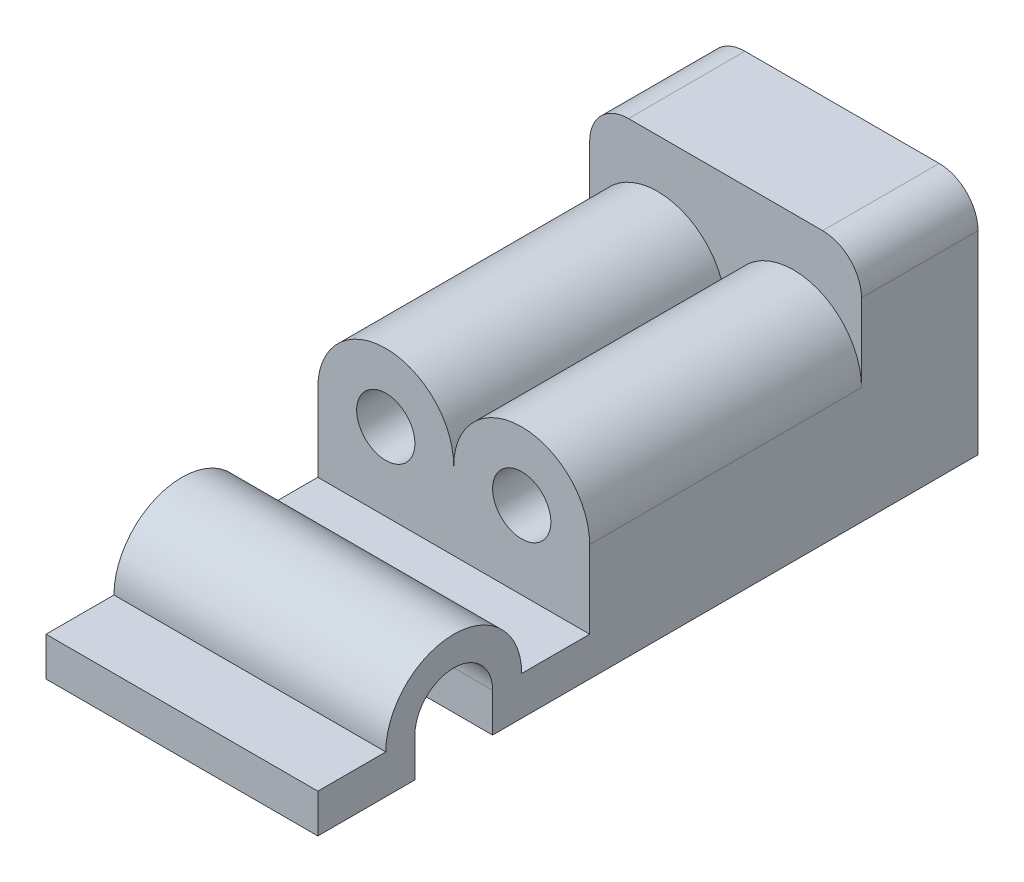
ISO-10303-21;
HEADER;
FILE_DESCRIPTION(('STEP AP214'),'2;1');
FILE_NAME('part.step','',(''),(''),'','','');
FILE_SCHEMA(('AUTOMOTIVE_DESIGN { 1 0 10303 214 1 1 1 1 }'));
ENDSEC;
DATA;
#1=APPLICATION_CONTEXT('core data for automotive mechanical design processes');
#2=APPLICATION_PROTOCOL_DEFINITION('international standard','automotive_design',2000,#1);
#3=PRODUCT_CONTEXT('',#1,'mechanical');
#4=PRODUCT('Part','Part','',(#3));
#5=PRODUCT_RELATED_PRODUCT_CATEGORY('part','',(#4));
#6=PRODUCT_DEFINITION_FORMATION('','',#4);
#7=PRODUCT_DEFINITION_CONTEXT('part definition',#1,'design');
#8=PRODUCT_DEFINITION('design','',#6,#7);
#9=PRODUCT_DEFINITION_SHAPE('','',#8);
#10=(LENGTH_UNIT() NAMED_UNIT(*) SI_UNIT(.MILLI.,.METRE.));
#11=(NAMED_UNIT(*) PLANE_ANGLE_UNIT() SI_UNIT($,.RADIAN.));
#12=(NAMED_UNIT(*) SI_UNIT($,.STERADIAN.) SOLID_ANGLE_UNIT());
#13=UNCERTAINTY_MEASURE_WITH_UNIT(LENGTH_MEASURE(1.E-05),#10,'distance_accuracy_value','');
#14=(GEOMETRIC_REPRESENTATION_CONTEXT(3) GLOBAL_UNCERTAINTY_ASSIGNED_CONTEXT((#13)) GLOBAL_UNIT_ASSIGNED_CONTEXT((#10,
#11,#12)) REPRESENTATION_CONTEXT('',''));
#15=CARTESIAN_POINT('',(0.,0.,0.));
#16=DIRECTION('',(0.,0.,1.));
#17=DIRECTION('',(1.,0.,0.));
#18=AXIS2_PLACEMENT_3D('',#15,#16,#17);
#19=CARTESIAN_POINT('',(0.,0.,100.));
#20=DIRECTION('',(0.,0.,-1.));
#21=DIRECTION('',(-1.,0.,0.));
#22=AXIS2_PLACEMENT_3D('',#19,#20,#21);
#23=PLANE('',#22);
#24=CARTESIAN_POINT('',(-17.5,30.,100.));
#25=DIRECTION('',(0.,0.,1.));
#26=DIRECTION('',(1.,0.,0.));
#27=AXIS2_PLACEMENT_3D('',#24,#25,#26);
#28=CIRCLE('',#27,7.5);
#29=CARTESIAN_POINT('',(-10.,30.,100.));
#30=VERTEX_POINT('',#29);
#31=EDGE_CURVE('E226',#30,#30,#28,.T.);
#32=ORIENTED_EDGE('',*,*,#31,.F.);
#33=EDGE_LOOP('',(#32));
#34=FACE_BOUND('',#33,.T.);
#35=CARTESIAN_POINT('',(17.5,30.,100.));
#36=DIRECTION('',(0.,0.,1.));
#37=DIRECTION('',(-1.,0.,0.));
#38=AXIS2_PLACEMENT_3D('',#35,#36,#37);
#39=CIRCLE('',#38,7.49999999999999);
#40=CARTESIAN_POINT('',(9.99999999999999,30.,100.));
#41=VERTEX_POINT('',#40);
#42=EDGE_CURVE('E232',#41,#41,#39,.T.);
#43=ORIENTED_EDGE('',*,*,#42,.F.);
#44=EDGE_LOOP('',(#43));
#45=FACE_BOUND('',#44,.T.);
#46=DIRECTION('',(-1.,0.,0.));
#47=VECTOR('',#46,1.);
#48=CARTESIAN_POINT('',(110.208044782457,10.,100.));
#49=LINE('',#48,#47);
#50=CARTESIAN_POINT('',(35.,10.,100.));
#51=VERTEX_POINT('',#50);
#52=CARTESIAN_POINT('',(-35.,10.,100.));
#53=VERTEX_POINT('',#52);
#54=EDGE_CURVE('E205',#51,#53,#49,.T.);
#55=ORIENTED_EDGE('',*,*,#54,.F.);
#56=DIRECTION('',(0.,1.,0.));
#57=VECTOR('',#56,1.);
#58=CARTESIAN_POINT('',(35.,60.,100.));
#59=LINE('',#58,#57);
#60=CARTESIAN_POINT('',(35.,30.,100.));
#61=VERTEX_POINT('',#60);
#62=EDGE_CURVE('E261',#51,#61,#59,.T.);
#63=ORIENTED_EDGE('',*,*,#62,.T.);
#64=CARTESIAN_POINT('',(17.5,30.,100.));
#65=DIRECTION('',(0.,0.,-1.));
#66=DIRECTION('',(-1.,0.,0.));
#67=AXIS2_PLACEMENT_3D('',#64,#65,#66);
#68=CIRCLE('',#67,17.5);
#69=CARTESIAN_POINT('',(0.,30.,100.));
#70=VERTEX_POINT('',#69);
#71=EDGE_CURVE('E238',#70,#61,#68,.T.);
#72=ORIENTED_EDGE('',*,*,#71,.F.);
#73=CARTESIAN_POINT('',(-17.5,30.,100.));
#74=DIRECTION('',(0.,0.,-1.));
#75=DIRECTION('',(1.,0.,0.));
#76=AXIS2_PLACEMENT_3D('',#73,#74,#75);
#77=CIRCLE('',#76,17.5);
#78=CARTESIAN_POINT('',(-35.,30.,100.));
#79=VERTEX_POINT('',#78);
#80=EDGE_CURVE('E225',#79,#70,#77,.T.);
#81=ORIENTED_EDGE('',*,*,#80,.F.);
#82=DIRECTION('',(0.,-1.,0.));
#83=VECTOR('',#82,1.);
#84=CARTESIAN_POINT('',(-35.,0.,100.));
#85=LINE('',#84,#83);
#86=EDGE_CURVE('E259',#79,#53,#85,.T.);
#87=ORIENTED_EDGE('',*,*,#86,.T.);
#88=EDGE_LOOP('',(#55,#63,#72,#81,#87));
#89=FACE_BOUND('',#88,.T.);
#90=ADVANCED_FACE('F33',(#34,#45,#89),#23,.F.);
#91=CARTESIAN_POINT('',(35.,60.,100.));
#92=DIRECTION('',(-1.,0.,0.));
#93=DIRECTION('',(0.,-1.,0.));
#94=AXIS2_PLACEMENT_3D('',#91,#92,#93);
#95=PLANE('',#94);
#96=DIRECTION('',(0.,1.,0.));
#97=VECTOR('',#96,1.);
#98=CARTESIAN_POINT('',(35.,60.,0.));
#99=LINE('',#98,#97);
#100=CARTESIAN_POINT('',(35.,0.,0.));
#101=VERTEX_POINT('',#100);
#102=CARTESIAN_POINT('',(35.,50.,0.));
#103=VERTEX_POINT('',#102);
#104=EDGE_CURVE('E267',#101,#103,#99,.T.);
#105=ORIENTED_EDGE('',*,*,#104,.T.);
#106=DIRECTION('',(0.,0.,-1.));
#107=VECTOR('',#106,1.);
#108=CARTESIAN_POINT('',(35.,50.,100.));
#109=LINE('',#108,#107);
#110=CARTESIAN_POINT('',(35.,50.,30.));
#111=VERTEX_POINT('',#110);
#112=EDGE_CURVE('E56',#103,#111,#109,.F.);
#113=ORIENTED_EDGE('',*,*,#112,.T.);
#114=DIRECTION('',(0.,1.,0.));
#115=VECTOR('',#114,1.);
#116=CARTESIAN_POINT('',(35.,30.,30.));
#117=LINE('',#116,#115);
#118=CARTESIAN_POINT('',(35.,30.,30.));
#119=VERTEX_POINT('',#118);
#120=EDGE_CURVE('E235',#119,#111,#117,.T.);
#121=ORIENTED_EDGE('',*,*,#120,.F.);
#122=DIRECTION('',(0.,0.,1.));
#123=VECTOR('',#122,1.);
#124=CARTESIAN_POINT('',(35.,30.,30.));
#125=LINE('',#124,#123);
#126=EDGE_CURVE('E253',#119,#61,#125,.T.);
#127=ORIENTED_EDGE('',*,*,#126,.T.);
#128=ORIENTED_EDGE('',*,*,#62,.F.);
#129=DIRECTION('',(0.,0.,1.));
#130=VECTOR('',#129,1.);
#131=CARTESIAN_POINT('',(35.,10.,117.5));
#132=LINE('',#131,#130);
#133=CARTESIAN_POINT('',(35.,10.,117.5));
#134=VERTEX_POINT('',#133);
#135=EDGE_CURVE('E186',#51,#134,#132,.T.);
#136=ORIENTED_EDGE('',*,*,#135,.T.);
#137=CARTESIAN_POINT('',(35.,10.,135.));
#138=DIRECTION('',(-1.,0.,0.));
#139=DIRECTION('',(0.,-1.,0.));
#140=AXIS2_PLACEMENT_3D('',#137,#138,#139);
#141=CIRCLE('',#140,17.5);
#142=CARTESIAN_POINT('',(35.,10.,152.5));
#143=VERTEX_POINT('',#142);
#144=EDGE_CURVE('E307',#134,#143,#141,.F.);
#145=ORIENTED_EDGE('',*,*,#144,.T.);
#146=DIRECTION('',(0.,0.,1.));
#147=VECTOR('',#146,1.);
#148=CARTESIAN_POINT('',(35.,10.,152.5));
#149=LINE('',#148,#147);
#150=CARTESIAN_POINT('',(35.,10.,170.));
#151=VERTEX_POINT('',#150);
#152=EDGE_CURVE('E306',#143,#151,#149,.T.);
#153=ORIENTED_EDGE('',*,*,#152,.T.);
#154=DIRECTION('',(0.,-1.,0.));
#155=VECTOR('',#154,1.);
#156=CARTESIAN_POINT('',(35.,9.99999999999997,170.));
#157=LINE('',#156,#155);
#158=CARTESIAN_POINT('',(35.,0.,170.));
#159=VERTEX_POINT('',#158);
#160=EDGE_CURVE('E304',#151,#159,#157,.T.);
#161=ORIENTED_EDGE('',*,*,#160,.T.);
#162=DIRECTION('',(0.,0.,-1.));
#163=VECTOR('',#162,1.);
#164=CARTESIAN_POINT('',(35.,0.,145.));
#165=LINE('',#164,#163);
#166=CARTESIAN_POINT('',(35.,0.,145.));
#167=VERTEX_POINT('',#166);
#168=EDGE_CURVE('E302',#159,#167,#165,.T.);
#169=ORIENTED_EDGE('',*,*,#168,.T.);
#170=DIRECTION('',(0.,1.,0.));
#171=VECTOR('',#170,1.);
#172=CARTESIAN_POINT('',(35.,9.99999999999997,145.));
#173=LINE('',#172,#171);
#174=CARTESIAN_POINT('',(35.,10.,145.));
#175=VERTEX_POINT('',#174);
#176=EDGE_CURVE('E298',#167,#175,#173,.T.);
#177=ORIENTED_EDGE('',*,*,#176,.T.);
#178=CARTESIAN_POINT('',(35.,10.,135.));
#179=DIRECTION('',(-1.,0.,0.));
#180=DIRECTION('',(0.,-1.,0.));
#181=AXIS2_PLACEMENT_3D('',#178,#179,#180);
#182=CIRCLE('',#181,10.);
#183=CARTESIAN_POINT('',(35.,10.,125.));
#184=VERTEX_POINT('',#183);
#185=EDGE_CURVE('E296',#175,#184,#182,.T.);
#186=ORIENTED_EDGE('',*,*,#185,.T.);
#187=DIRECTION('',(0.,-1.,0.));
#188=VECTOR('',#187,1.);
#189=CARTESIAN_POINT('',(35.,9.99999999999996,125.));
#190=LINE('',#189,#188);
#191=CARTESIAN_POINT('',(35.,0.,125.));
#192=VERTEX_POINT('',#191);
#193=EDGE_CURVE('E208',#184,#192,#190,.T.);
#194=ORIENTED_EDGE('',*,*,#193,.T.);
#195=DIRECTION('',(0.,0.,-1.));
#196=VECTOR('',#195,1.);
#197=CARTESIAN_POINT('',(35.,0.,100.));
#198=LINE('',#197,#196);
#199=EDGE_CURVE('E166',#192,#101,#198,.T.);
#200=ORIENTED_EDGE('',*,*,#199,.T.);
#201=EDGE_LOOP('',(#105,#113,#121,#127,#128,#136,#145,#153,#161,#169,#177,#186,#194,#200));
#202=FACE_BOUND('',#201,.T.);
#203=ADVANCED_FACE('F294',(#202),#95,.F.);
#204=CARTESIAN_POINT('',(-35.,60.,100.));
#205=DIRECTION('',(0.,-1.,0.));
#206=DIRECTION('',(1.,0.,0.));
#207=AXIS2_PLACEMENT_3D('',#204,#205,#206);
#208=PLANE('',#207);
#209=DIRECTION('',(-1.,0.,0.));
#210=VECTOR('',#209,1.);
#211=CARTESIAN_POINT('',(35.,60.,30.));
#212=LINE('',#211,#210);
#213=CARTESIAN_POINT('',(25.,60.,30.));
#214=VERTEX_POINT('',#213);
#215=CARTESIAN_POINT('',(-25.,60.,30.));
#216=VERTEX_POINT('',#215);
#217=EDGE_CURVE('E237',#214,#216,#212,.T.);
#218=ORIENTED_EDGE('',*,*,#217,.F.);
#219=DIRECTION('',(0.,0.,-1.));
#220=VECTOR('',#219,1.);
#221=CARTESIAN_POINT('',(25.,60.,100.));
#222=LINE('',#221,#220);
#223=CARTESIAN_POINT('',(25.,60.,0.));
#224=VERTEX_POINT('',#223);
#225=EDGE_CURVE('E273',#214,#224,#222,.T.);
#226=ORIENTED_EDGE('',*,*,#225,.T.);
#227=DIRECTION('',(-1.,0.,0.));
#228=VECTOR('',#227,1.);
#229=CARTESIAN_POINT('',(-35.,60.,0.));
#230=LINE('',#229,#228);
#231=CARTESIAN_POINT('',(-25.,60.,0.));
#232=VERTEX_POINT('',#231);
#233=EDGE_CURVE('E262',#224,#232,#230,.T.);
#234=ORIENTED_EDGE('',*,*,#233,.T.);
#235=DIRECTION('',(0.,0.,-1.));
#236=VECTOR('',#235,1.);
#237=CARTESIAN_POINT('',(-25.,60.,100.));
#238=LINE('',#237,#236);
#239=EDGE_CURVE('E165',#232,#216,#238,.F.);
#240=ORIENTED_EDGE('',*,*,#239,.T.);
#241=EDGE_LOOP('',(#218,#226,#234,#240));
#242=FACE_BOUND('',#241,.T.);
#243=ADVANCED_FACE('F287',(#242),#208,.F.);
#244=CARTESIAN_POINT('',(-35.,0.,100.));
#245=DIRECTION('',(1.,0.,0.));
#246=DIRECTION('',(0.,0.,-1.));
#247=AXIS2_PLACEMENT_3D('',#244,#245,#246);
#248=PLANE('',#247);
#249=DIRECTION('',(0.,-1.,0.));
#250=VECTOR('',#249,1.);
#251=CARTESIAN_POINT('',(-35.,60.,30.));
#252=LINE('',#251,#250);
#253=CARTESIAN_POINT('',(-35.,50.,30.));
#254=VERTEX_POINT('',#253);
#255=CARTESIAN_POINT('',(-35.,30.,30.));
#256=VERTEX_POINT('',#255);
#257=EDGE_CURVE('E240',#254,#256,#252,.T.);
#258=ORIENTED_EDGE('',*,*,#257,.F.);
#259=DIRECTION('',(0.,0.,-1.));
#260=VECTOR('',#259,1.);
#261=CARTESIAN_POINT('',(-35.,50.,100.));
#262=LINE('',#261,#260);
#263=CARTESIAN_POINT('',(-35.,50.,0.));
#264=VERTEX_POINT('',#263);
#265=EDGE_CURVE('E11',#254,#264,#262,.T.);
#266=ORIENTED_EDGE('',*,*,#265,.T.);
#267=DIRECTION('',(0.,-1.,0.));
#268=VECTOR('',#267,1.);
#269=CARTESIAN_POINT('',(-35.,0.,0.));
#270=LINE('',#269,#268);
#271=CARTESIAN_POINT('',(-35.,0.,0.));
#272=VERTEX_POINT('',#271);
#273=EDGE_CURVE('E162',#264,#272,#270,.T.);
#274=ORIENTED_EDGE('',*,*,#273,.T.);
#275=DIRECTION('',(0.,0.,-1.));
#276=VECTOR('',#275,1.);
#277=CARTESIAN_POINT('',(-35.,0.,100.));
#278=LINE('',#277,#276);
#279=CARTESIAN_POINT('',(-35.,0.,125.));
#280=VERTEX_POINT('',#279);
#281=EDGE_CURVE('E155',#280,#272,#278,.T.);
#282=ORIENTED_EDGE('',*,*,#281,.F.);
#283=DIRECTION('',(0.,1.,0.));
#284=VECTOR('',#283,1.);
#285=CARTESIAN_POINT('',(-35.,10.,125.));
#286=LINE('',#285,#284);
#287=CARTESIAN_POINT('',(-35.,10.,125.));
#288=VERTEX_POINT('',#287);
#289=EDGE_CURVE('E160',#280,#288,#286,.T.);
#290=ORIENTED_EDGE('',*,*,#289,.T.);
#291=CARTESIAN_POINT('',(-35.,10.,135.));
#292=DIRECTION('',(1.,0.,0.));
#293=DIRECTION('',(0.,0.,1.));
#294=AXIS2_PLACEMENT_3D('',#291,#292,#293);
#295=CIRCLE('',#294,10.);
#296=CARTESIAN_POINT('',(-35.,10.,145.));
#297=VERTEX_POINT('',#296);
#298=EDGE_CURVE('E181',#288,#297,#295,.T.);
#299=ORIENTED_EDGE('',*,*,#298,.T.);
#300=DIRECTION('',(0.,-1.,0.));
#301=VECTOR('',#300,1.);
#302=CARTESIAN_POINT('',(-35.,10.,145.));
#303=LINE('',#302,#301);
#304=CARTESIAN_POINT('',(-35.,0.,145.));
#305=VERTEX_POINT('',#304);
#306=EDGE_CURVE('E183',#297,#305,#303,.T.);
#307=ORIENTED_EDGE('',*,*,#306,.T.);
#308=DIRECTION('',(0.,0.,1.));
#309=VECTOR('',#308,1.);
#310=CARTESIAN_POINT('',(-35.,0.,145.));
#311=LINE('',#310,#309);
#312=CARTESIAN_POINT('',(-35.,0.,170.));
#313=VERTEX_POINT('',#312);
#314=EDGE_CURVE('E191',#305,#313,#311,.T.);
#315=ORIENTED_EDGE('',*,*,#314,.T.);
#316=DIRECTION('',(0.,1.,0.));
#317=VECTOR('',#316,1.);
#318=CARTESIAN_POINT('',(-35.,10.,170.));
#319=LINE('',#318,#317);
#320=CARTESIAN_POINT('',(-35.,10.,170.));
#321=VERTEX_POINT('',#320);
#322=EDGE_CURVE('E194',#313,#321,#319,.T.);
#323=ORIENTED_EDGE('',*,*,#322,.T.);
#324=DIRECTION('',(0.,0.,-1.));
#325=VECTOR('',#324,1.);
#326=CARTESIAN_POINT('',(-35.,10.,152.5));
#327=LINE('',#326,#325);
#328=CARTESIAN_POINT('',(-35.,10.,152.5));
#329=VERTEX_POINT('',#328);
#330=EDGE_CURVE('E197',#321,#329,#327,.T.);
#331=ORIENTED_EDGE('',*,*,#330,.T.);
#332=CARTESIAN_POINT('',(-35.,10.,135.));
#333=DIRECTION('',(-1.,0.,0.));
#334=DIRECTION('',(0.,0.,1.));
#335=AXIS2_PLACEMENT_3D('',#332,#333,#334);
#336=CIRCLE('',#335,17.5);
#337=CARTESIAN_POINT('',(-35.,10.,117.5));
#338=VERTEX_POINT('',#337);
#339=EDGE_CURVE('E200',#329,#338,#336,.T.);
#340=ORIENTED_EDGE('',*,*,#339,.T.);
#341=DIRECTION('',(0.,0.,-1.));
#342=VECTOR('',#341,1.);
#343=CARTESIAN_POINT('',(-35.,10.,117.5));
#344=LINE('',#343,#342);
#345=EDGE_CURVE('E176',#338,#53,#344,.T.);
#346=ORIENTED_EDGE('',*,*,#345,.T.);
#347=ORIENTED_EDGE('',*,*,#86,.F.);
#348=DIRECTION('',(0.,0.,1.));
#349=VECTOR('',#348,1.);
#350=CARTESIAN_POINT('',(-35.,30.,30.));
#351=LINE('',#350,#349);
#352=EDGE_CURVE('E248',#256,#79,#351,.T.);
#353=ORIENTED_EDGE('',*,*,#352,.F.);
#354=EDGE_LOOP('',(#258,#266,#274,#282,#290,#299,#307,#315,#323,#331,#340,#346,#347,#353));
#355=FACE_BOUND('',#354,.T.);
#356=ADVANCED_FACE('F157',(#355),#248,.F.);
#357=CARTESIAN_POINT('',(-35.,0.,100.));
#358=DIRECTION('',(0.,1.,0.));
#359=DIRECTION('',(-1.,0.,0.));
#360=AXIS2_PLACEMENT_3D('',#357,#358,#359);
#361=PLANE('',#360);
#362=DIRECTION('',(1.,0.,0.));
#363=VECTOR('',#362,1.);
#364=CARTESIAN_POINT('',(-35.,0.,0.));
#365=LINE('',#364,#363);
#366=EDGE_CURVE('E265',#272,#101,#365,.T.);
#367=ORIENTED_EDGE('',*,*,#366,.T.);
#368=ORIENTED_EDGE('',*,*,#199,.F.);
#369=DIRECTION('',(-1.,0.,0.));
#370=VECTOR('',#369,1.);
#371=CARTESIAN_POINT('',(110.208044782457,0.,125.));
#372=LINE('',#371,#370);
#373=EDGE_CURVE('E169',#192,#280,#372,.T.);
#374=ORIENTED_EDGE('',*,*,#373,.T.);
#375=ORIENTED_EDGE('',*,*,#281,.T.);
#376=EDGE_LOOP('',(#367,#368,#374,#375));
#377=FACE_BOUND('',#376,.T.);
#378=ADVANCED_FACE('F170',(#377),#361,.F.);
#379=CARTESIAN_POINT('',(0.,0.,0.));
#380=DIRECTION('',(0.,0.,-1.));
#381=DIRECTION('',(-1.,0.,0.));
#382=AXIS2_PLACEMENT_3D('',#379,#380,#381);
#383=PLANE('',#382);
#384=ORIENTED_EDGE('',*,*,#233,.F.);
#385=CARTESIAN_POINT('',(25.,50.,0.));
#386=DIRECTION('',(0.,0.,-1.));
#387=DIRECTION('',(-1.,0.,0.));
#388=AXIS2_PLACEMENT_3D('',#385,#386,#387);
#389=CIRCLE('',#388,10.);
#390=EDGE_CURVE('E278',#224,#103,#389,.T.);
#391=ORIENTED_EDGE('',*,*,#390,.T.);
#392=ORIENTED_EDGE('',*,*,#104,.F.);
#393=ORIENTED_EDGE('',*,*,#366,.F.);
#394=ORIENTED_EDGE('',*,*,#273,.F.);
#395=CARTESIAN_POINT('',(-25.,50.,0.));
#396=DIRECTION('',(0.,0.,-1.));
#397=DIRECTION('',(-1.,0.,0.));
#398=AXIS2_PLACEMENT_3D('',#395,#396,#397);
#399=CIRCLE('',#398,10.);
#400=EDGE_CURVE('E276',#264,#232,#399,.T.);
#401=ORIENTED_EDGE('',*,*,#400,.T.);
#402=EDGE_LOOP('',(#384,#391,#392,#393,#394,#401));
#403=FACE_BOUND('',#402,.T.);
#404=ADVANCED_FACE('F293',(#403),#383,.T.);
#405=CARTESIAN_POINT('',(17.5,30.,30.));
#406=DIRECTION('',(0.,0.,1.));
#407=DIRECTION('',(1.,0.,0.));
#408=AXIS2_PLACEMENT_3D('',#405,#406,#407);
#409=CYLINDRICAL_SURFACE('',#408,17.5);
#410=ORIENTED_EDGE('',*,*,#71,.T.);
#411=ORIENTED_EDGE('',*,*,#126,.F.);
#412=CARTESIAN_POINT('',(17.5,30.,30.));
#413=DIRECTION('',(0.,0.,-1.));
#414=DIRECTION('',(-1.,0.,0.));
#415=AXIS2_PLACEMENT_3D('',#412,#413,#414);
#416=CIRCLE('',#415,17.5);
#417=CARTESIAN_POINT('',(0.,30.,30.));
#418=VERTEX_POINT('',#417);
#419=EDGE_CURVE('E245',#418,#119,#416,.T.);
#420=ORIENTED_EDGE('',*,*,#419,.F.);
#421=DIRECTION('',(0.,0.,1.));
#422=VECTOR('',#421,1.);
#423=CARTESIAN_POINT('',(0.,30.,30.));
#424=LINE('',#423,#422);
#425=EDGE_CURVE('E256',#418,#70,#424,.T.);
#426=ORIENTED_EDGE('',*,*,#425,.T.);
#427=EDGE_LOOP('',(#410,#411,#420,#426));
#428=FACE_BOUND('',#427,.T.);
#429=ADVANCED_FACE('F366',(#428),#409,.T.);
#430=CARTESIAN_POINT('',(-17.5,30.,30.));
#431=DIRECTION('',(0.,0.,1.));
#432=DIRECTION('',(1.,0.,0.));
#433=AXIS2_PLACEMENT_3D('',#430,#431,#432);
#434=CYLINDRICAL_SURFACE('',#433,17.5);
#435=ORIENTED_EDGE('',*,*,#80,.T.);
#436=ORIENTED_EDGE('',*,*,#425,.F.);
#437=CARTESIAN_POINT('',(-17.5,30.,30.));
#438=DIRECTION('',(0.,0.,-1.));
#439=DIRECTION('',(1.,0.,0.));
#440=AXIS2_PLACEMENT_3D('',#437,#438,#439);
#441=CIRCLE('',#440,17.5);
#442=EDGE_CURVE('E242',#256,#418,#441,.T.);
#443=ORIENTED_EDGE('',*,*,#442,.F.);
#444=ORIENTED_EDGE('',*,*,#352,.T.);
#445=EDGE_LOOP('',(#435,#436,#443,#444));
#446=FACE_BOUND('',#445,.T.);
#447=ADVANCED_FACE('F362',(#446),#434,.T.);
#448=CARTESIAN_POINT('',(-17.5,30.,30.));
#449=DIRECTION('',(0.,0.,1.));
#450=DIRECTION('',(1.,0.,0.));
#451=AXIS2_PLACEMENT_3D('',#448,#449,#450);
#452=PLANE('',#451);
#453=ORIENTED_EDGE('',*,*,#120,.T.);
#454=CARTESIAN_POINT('',(25.,50.,30.));
#455=DIRECTION('',(0.,0.,1.));
#456=DIRECTION('',(1.,0.,0.));
#457=AXIS2_PLACEMENT_3D('',#454,#455,#456);
#458=CIRCLE('',#457,10.);
#459=EDGE_CURVE('E41',#111,#214,#458,.T.);
#460=ORIENTED_EDGE('',*,*,#459,.T.);
#461=ORIENTED_EDGE('',*,*,#217,.T.);
#462=CARTESIAN_POINT('',(-25.,50.,30.));
#463=DIRECTION('',(0.,0.,1.));
#464=DIRECTION('',(1.,0.,0.));
#465=AXIS2_PLACEMENT_3D('',#462,#463,#464);
#466=CIRCLE('',#465,10.);
#467=EDGE_CURVE('E48',#216,#254,#466,.T.);
#468=ORIENTED_EDGE('',*,*,#467,.T.);
#469=ORIENTED_EDGE('',*,*,#257,.T.);
#470=ORIENTED_EDGE('',*,*,#442,.T.);
#471=ORIENTED_EDGE('',*,*,#419,.T.);
#472=EDGE_LOOP('',(#453,#460,#461,#468,#469,#470,#471));
#473=FACE_BOUND('',#472,.T.);
#474=ADVANCED_FACE('F283',(#473),#452,.T.);
#475=CARTESIAN_POINT('',(-17.5,30.,30.));
#476=DIRECTION('',(0.,0.,1.));
#477=DIRECTION('',(1.,0.,0.));
#478=AXIS2_PLACEMENT_3D('',#475,#476,#477);
#479=CYLINDRICAL_SURFACE('',#478,7.5);
#480=CARTESIAN_POINT('',(-17.5,30.,30.));
#481=DIRECTION('',(0.,0.,1.));
#482=DIRECTION('',(1.,0.,0.));
#483=AXIS2_PLACEMENT_3D('',#480,#481,#482);
#484=CIRCLE('',#483,7.5);
#485=CARTESIAN_POINT('',(-10.,30.,30.));
#486=VERTEX_POINT('',#485);
#487=EDGE_CURVE('E222',#486,#486,#484,.T.);
#488=ORIENTED_EDGE('',*,*,#487,.F.);
#489=EDGE_LOOP('',(#488));
#490=FACE_BOUND('',#489,.T.);
#491=ORIENTED_EDGE('',*,*,#31,.T.);
#492=EDGE_LOOP('',(#491));
#493=FACE_BOUND('',#492,.T.);
#494=ADVANCED_FACE('F394',(#490,#493),#479,.F.);
#495=CARTESIAN_POINT('',(-17.5,30.,30.));
#496=DIRECTION('',(0.,0.,1.));
#497=DIRECTION('',(1.,0.,0.));
#498=AXIS2_PLACEMENT_3D('',#495,#496,#497);
#499=PLANE('',#498);
#500=ORIENTED_EDGE('',*,*,#487,.T.);
#501=EDGE_LOOP('',(#500));
#502=FACE_BOUND('',#501,.T.);
#503=ADVANCED_FACE('F399',(#502),#499,.T.);
#504=CARTESIAN_POINT('',(17.5,30.,30.));
#505=DIRECTION('',(0.,0.,1.));
#506=DIRECTION('',(1.,0.,0.));
#507=AXIS2_PLACEMENT_3D('',#504,#505,#506);
#508=CYLINDRICAL_SURFACE('',#507,7.49999999999999);
#509=CARTESIAN_POINT('',(17.5,30.,30.));
#510=DIRECTION('',(0.,0.,1.));
#511=DIRECTION('',(-1.,0.,0.));
#512=AXIS2_PLACEMENT_3D('',#509,#510,#511);
#513=CIRCLE('',#512,7.49999999999999);
#514=CARTESIAN_POINT('',(9.99999999999999,30.,30.));
#515=VERTEX_POINT('',#514);
#516=EDGE_CURVE('E229',#515,#515,#513,.T.);
#517=ORIENTED_EDGE('',*,*,#516,.F.);
#518=EDGE_LOOP('',(#517));
#519=FACE_BOUND('',#518,.T.);
#520=ORIENTED_EDGE('',*,*,#42,.T.);
#521=EDGE_LOOP('',(#520));
#522=FACE_BOUND('',#521,.T.);
#523=ADVANCED_FACE('F395',(#519,#522),#508,.F.);
#524=CARTESIAN_POINT('',(17.5,30.,30.));
#525=DIRECTION('',(0.,0.,-1.));
#526=DIRECTION('',(-1.,0.,0.));
#527=AXIS2_PLACEMENT_3D('',#524,#525,#526);
#528=PLANE('',#527);
#529=ORIENTED_EDGE('',*,*,#516,.T.);
#530=EDGE_LOOP('',(#529));
#531=FACE_BOUND('',#530,.T.);
#532=ADVANCED_FACE('F398',(#531),#528,.F.);
#533=CARTESIAN_POINT('',(110.208044782457,10.,117.5));
#534=DIRECTION('',(0.,1.,0.));
#535=DIRECTION('',(0.,0.,1.));
#536=AXIS2_PLACEMENT_3D('',#533,#534,#535);
#537=PLANE('',#536);
#538=ORIENTED_EDGE('',*,*,#135,.F.);
#539=ORIENTED_EDGE('',*,*,#54,.T.);
#540=ORIENTED_EDGE('',*,*,#345,.F.);
#541=DIRECTION('',(-1.,0.,0.));
#542=VECTOR('',#541,1.);
#543=CARTESIAN_POINT('',(110.208044782457,10.,117.5));
#544=LINE('',#543,#542);
#545=EDGE_CURVE('E209',#134,#338,#544,.T.);
#546=ORIENTED_EDGE('',*,*,#545,.F.);
#547=EDGE_LOOP('',(#538,#539,#540,#546));
#548=FACE_BOUND('',#547,.T.);
#549=ADVANCED_FACE('F319',(#548),#537,.T.);
#550=CARTESIAN_POINT('',(110.208044782457,10.,135.));
#551=DIRECTION('',(-1.,0.,0.));
#552=DIRECTION('',(0.,0.,1.));
#553=AXIS2_PLACEMENT_3D('',#550,#551,#552);
#554=CYLINDRICAL_SURFACE('',#553,17.5);
#555=ORIENTED_EDGE('',*,*,#144,.F.);
#556=ORIENTED_EDGE('',*,*,#545,.T.);
#557=ORIENTED_EDGE('',*,*,#339,.F.);
#558=DIRECTION('',(-1.,0.,0.));
#559=VECTOR('',#558,1.);
#560=CARTESIAN_POINT('',(110.208044782457,10.,152.5));
#561=LINE('',#560,#559);
#562=EDGE_CURVE('E211',#143,#329,#561,.T.);
#563=ORIENTED_EDGE('',*,*,#562,.F.);
#564=EDGE_LOOP('',(#555,#556,#557,#563));
#565=FACE_BOUND('',#564,.T.);
#566=ADVANCED_FACE('F316',(#565),#554,.T.);
#567=CARTESIAN_POINT('',(110.208044782457,10.,152.5));
#568=DIRECTION('',(0.,1.,0.));
#569=DIRECTION('',(0.,0.,1.));
#570=AXIS2_PLACEMENT_3D('',#567,#568,#569);
#571=PLANE('',#570);
#572=ORIENTED_EDGE('',*,*,#152,.F.);
#573=ORIENTED_EDGE('',*,*,#562,.T.);
#574=ORIENTED_EDGE('',*,*,#330,.F.);
#575=DIRECTION('',(-1.,0.,0.));
#576=VECTOR('',#575,1.);
#577=CARTESIAN_POINT('',(110.208044782457,10.,170.));
#578=LINE('',#577,#576);
#579=EDGE_CURVE('E213',#151,#321,#578,.T.);
#580=ORIENTED_EDGE('',*,*,#579,.F.);
#581=EDGE_LOOP('',(#572,#573,#574,#580));
#582=FACE_BOUND('',#581,.T.);
#583=ADVANCED_FACE('F326',(#582),#571,.T.);
#584=CARTESIAN_POINT('',(110.208044782457,10.,170.));
#585=DIRECTION('',(0.,0.,1.));
#586=DIRECTION('',(1.,0.,0.));
#587=AXIS2_PLACEMENT_3D('',#584,#585,#586);
#588=PLANE('',#587);
#589=ORIENTED_EDGE('',*,*,#160,.F.);
#590=ORIENTED_EDGE('',*,*,#579,.T.);
#591=ORIENTED_EDGE('',*,*,#322,.F.);
#592=DIRECTION('',(-1.,0.,0.));
#593=VECTOR('',#592,1.);
#594=CARTESIAN_POINT('',(110.208044782457,0.,170.));
#595=LINE('',#594,#593);
#596=EDGE_CURVE('E215',#159,#313,#595,.T.);
#597=ORIENTED_EDGE('',*,*,#596,.F.);
#598=EDGE_LOOP('',(#589,#590,#591,#597));
#599=FACE_BOUND('',#598,.T.);
#600=ADVANCED_FACE('F331',(#599),#588,.T.);
#601=CARTESIAN_POINT('',(110.208044782457,0.,145.));
#602=DIRECTION('',(0.,-1.,0.));
#603=DIRECTION('',(0.,0.,-1.));
#604=AXIS2_PLACEMENT_3D('',#601,#602,#603);
#605=PLANE('',#604);
#606=ORIENTED_EDGE('',*,*,#168,.F.);
#607=ORIENTED_EDGE('',*,*,#596,.T.);
#608=ORIENTED_EDGE('',*,*,#314,.F.);
#609=DIRECTION('',(-1.,0.,0.));
#610=VECTOR('',#609,1.);
#611=CARTESIAN_POINT('',(110.208044782457,0.,145.));
#612=LINE('',#611,#610);
#613=EDGE_CURVE('E217',#167,#305,#612,.T.);
#614=ORIENTED_EDGE('',*,*,#613,.F.);
#615=EDGE_LOOP('',(#606,#607,#608,#614));
#616=FACE_BOUND('',#615,.T.);
#617=ADVANCED_FACE('F334',(#616),#605,.T.);
#618=CARTESIAN_POINT('',(110.208044782457,10.,145.));
#619=DIRECTION('',(0.,0.,-1.));
#620=DIRECTION('',(-1.,0.,0.));
#621=AXIS2_PLACEMENT_3D('',#618,#619,#620);
#622=PLANE('',#621);
#623=ORIENTED_EDGE('',*,*,#176,.F.);
#624=ORIENTED_EDGE('',*,*,#613,.T.);
#625=ORIENTED_EDGE('',*,*,#306,.F.);
#626=DIRECTION('',(-1.,0.,0.));
#627=VECTOR('',#626,1.);
#628=CARTESIAN_POINT('',(110.208044782457,10.,145.));
#629=LINE('',#628,#627);
#630=EDGE_CURVE('E219',#175,#297,#629,.T.);
#631=ORIENTED_EDGE('',*,*,#630,.F.);
#632=EDGE_LOOP('',(#623,#624,#625,#631));
#633=FACE_BOUND('',#632,.T.);
#634=ADVANCED_FACE('F339',(#633),#622,.T.);
#635=CARTESIAN_POINT('',(110.208044782457,10.,135.));
#636=DIRECTION('',(-1.,0.,0.));
#637=DIRECTION('',(0.,0.,1.));
#638=AXIS2_PLACEMENT_3D('',#635,#636,#637);
#639=CYLINDRICAL_SURFACE('',#638,10.);
#640=ORIENTED_EDGE('',*,*,#185,.F.);
#641=ORIENTED_EDGE('',*,*,#630,.T.);
#642=ORIENTED_EDGE('',*,*,#298,.F.);
#643=DIRECTION('',(-1.,0.,0.));
#644=VECTOR('',#643,1.);
#645=CARTESIAN_POINT('',(110.208044782457,10.,125.));
#646=LINE('',#645,#644);
#647=EDGE_CURVE('E175',#184,#288,#646,.T.);
#648=ORIENTED_EDGE('',*,*,#647,.F.);
#649=EDGE_LOOP('',(#640,#641,#642,#648));
#650=FACE_BOUND('',#649,.T.);
#651=ADVANCED_FACE('F342',(#650),#639,.F.);
#652=CARTESIAN_POINT('',(110.208044782457,10.,125.));
#653=DIRECTION('',(0.,0.,1.));
#654=DIRECTION('',(0.,-1.,0.));
#655=AXIS2_PLACEMENT_3D('',#652,#653,#654);
#656=PLANE('',#655);
#657=ORIENTED_EDGE('',*,*,#193,.F.);
#658=ORIENTED_EDGE('',*,*,#647,.T.);
#659=ORIENTED_EDGE('',*,*,#289,.F.);
#660=ORIENTED_EDGE('',*,*,#373,.F.);
#661=EDGE_LOOP('',(#657,#658,#659,#660));
#662=FACE_BOUND('',#661,.T.);
#663=ADVANCED_FACE('F178',(#662),#656,.T.);
#664=CARTESIAN_POINT('',(25.,50.,100.));
#665=DIRECTION('',(0.,0.,-1.));
#666=DIRECTION('',(-1.,0.,0.));
#667=AXIS2_PLACEMENT_3D('',#664,#665,#666);
#668=CYLINDRICAL_SURFACE('',#667,10.);
#669=ORIENTED_EDGE('',*,*,#459,.F.);
#670=ORIENTED_EDGE('',*,*,#112,.F.);
#671=ORIENTED_EDGE('',*,*,#390,.F.);
#672=ORIENTED_EDGE('',*,*,#225,.F.);
#673=EDGE_LOOP('',(#669,#670,#671,#672));
#674=FACE_BOUND('',#673,.T.);
#675=ADVANCED_FACE('F290',(#674),#668,.T.);
#676=CARTESIAN_POINT('',(-25.,50.,100.));
#677=DIRECTION('',(0.,0.,-1.));
#678=DIRECTION('',(-1.,0.,0.));
#679=AXIS2_PLACEMENT_3D('',#676,#677,#678);
#680=CYLINDRICAL_SURFACE('',#679,10.);
#681=ORIENTED_EDGE('',*,*,#467,.F.);
#682=ORIENTED_EDGE('',*,*,#239,.F.);
#683=ORIENTED_EDGE('',*,*,#400,.F.);
#684=ORIENTED_EDGE('',*,*,#265,.F.);
#685=EDGE_LOOP('',(#681,#682,#683,#684));
#686=FACE_BOUND('',#685,.T.);
#687=ADVANCED_FACE('F35',(#686),#680,.T.);
#688=CLOSED_SHELL('',(#90,#203,#243,#356,#378,#404,#429,#447,#474,#494,#503,#523,#532,#549,#566,
#583,#600,#617,#634,#651,#663,#675,#687));
#689=MANIFOLD_SOLID_BREP('B2',#688);
#690=ADVANCED_BREP_SHAPE_REPRESENTATION('',(#18,#689),#14);
#691=SHAPE_DEFINITION_REPRESENTATION(#9,#690);
ENDSEC;
END-ISO-10303-21;
